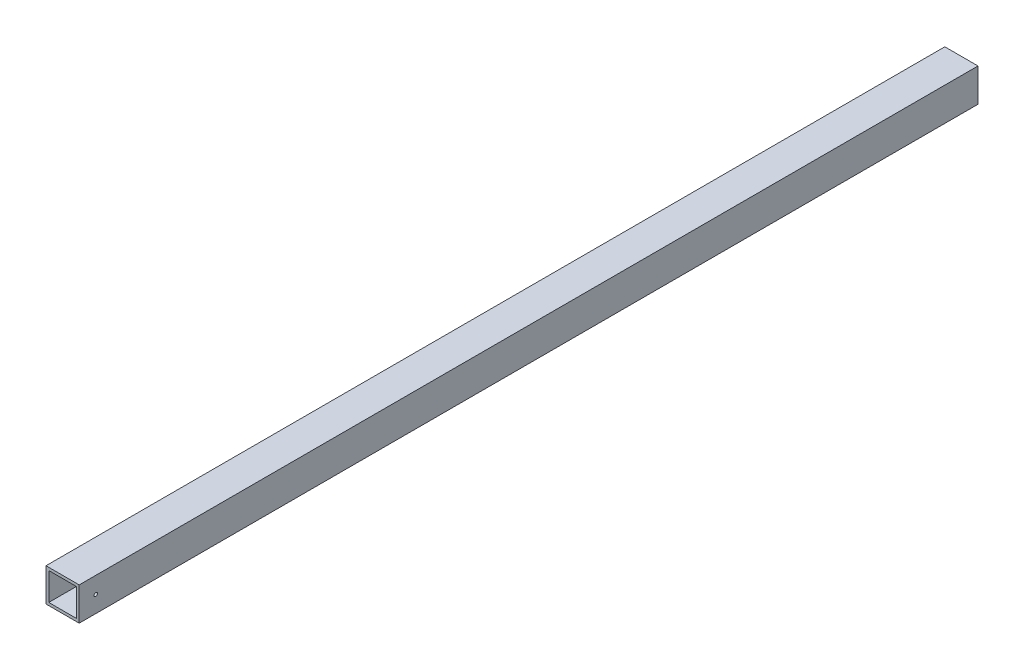
ISO-10303-21;
HEADER;
FILE_DESCRIPTION(('STEP AP214'),'2;1');
FILE_NAME('part.step','',(''),(''),'','','');
FILE_SCHEMA(('AUTOMOTIVE_DESIGN { 1 0 10303 214 1 1 1 1 }'));
ENDSEC;
DATA;
#1=APPLICATION_CONTEXT('core data for automotive mechanical design processes');
#2=APPLICATION_PROTOCOL_DEFINITION('international standard','automotive_design',2000,#1);
#3=PRODUCT_CONTEXT('',#1,'mechanical');
#4=PRODUCT('Part','Part','',(#3));
#5=PRODUCT_RELATED_PRODUCT_CATEGORY('part','',(#4));
#6=PRODUCT_DEFINITION_FORMATION('','',#4);
#7=PRODUCT_DEFINITION_CONTEXT('part definition',#1,'design');
#8=PRODUCT_DEFINITION('design','',#6,#7);
#9=PRODUCT_DEFINITION_SHAPE('','',#8);
#10=(LENGTH_UNIT() NAMED_UNIT(*) SI_UNIT(.MILLI.,.METRE.));
#11=(NAMED_UNIT(*) PLANE_ANGLE_UNIT() SI_UNIT($,.RADIAN.));
#12=(NAMED_UNIT(*) SI_UNIT($,.STERADIAN.) SOLID_ANGLE_UNIT());
#13=UNCERTAINTY_MEASURE_WITH_UNIT(LENGTH_MEASURE(1.E-05),#10,'distance_accuracy_value','');
#14=(GEOMETRIC_REPRESENTATION_CONTEXT(3) GLOBAL_UNCERTAINTY_ASSIGNED_CONTEXT((#13)) GLOBAL_UNIT_ASSIGNED_CONTEXT((#10,
#11,#12)) REPRESENTATION_CONTEXT('',''));
#15=CARTESIAN_POINT('',(0.,0.,0.));
#16=DIRECTION('',(0.,0.,1.));
#17=DIRECTION('',(1.,0.,0.));
#18=AXIS2_PLACEMENT_3D('',#15,#16,#17);
#19=CARTESIAN_POINT('',(0.,0.,650.));
#20=DIRECTION('',(0.,0.,1.));
#21=DIRECTION('',(1.,0.,0.));
#22=AXIS2_PLACEMENT_3D('',#19,#20,#21);
#23=PLANE('',#22);
#24=DIRECTION('',(0.,-1.,0.));
#25=VECTOR('',#24,1.);
#26=CARTESIAN_POINT('',(-12.,12.,650.));
#27=LINE('',#26,#25);
#28=CARTESIAN_POINT('',(-12.,12.,650.));
#29=VERTEX_POINT('',#28);
#30=CARTESIAN_POINT('',(-12.,-12.,650.));
#31=VERTEX_POINT('',#30);
#32=EDGE_CURVE('E138',#29,#31,#27,.T.);
#33=ORIENTED_EDGE('',*,*,#32,.T.);
#34=DIRECTION('',(1.,0.,0.));
#35=VECTOR('',#34,1.);
#36=CARTESIAN_POINT('',(-12.,-12.,650.));
#37=LINE('',#36,#35);
#38=CARTESIAN_POINT('',(12.,-12.,650.));
#39=VERTEX_POINT('',#38);
#40=EDGE_CURVE('E141',#31,#39,#37,.T.);
#41=ORIENTED_EDGE('',*,*,#40,.T.);
#42=DIRECTION('',(0.,1.,0.));
#43=VECTOR('',#42,1.);
#44=CARTESIAN_POINT('',(12.,12.,650.));
#45=LINE('',#44,#43);
#46=CARTESIAN_POINT('',(12.,12.,650.));
#47=VERTEX_POINT('',#46);
#48=EDGE_CURVE('E144',#39,#47,#45,.T.);
#49=ORIENTED_EDGE('',*,*,#48,.T.);
#50=DIRECTION('',(-1.,0.,0.));
#51=VECTOR('',#50,1.);
#52=CARTESIAN_POINT('',(-12.,12.,650.));
#53=LINE('',#52,#51);
#54=EDGE_CURVE('E146',#47,#29,#53,.T.);
#55=ORIENTED_EDGE('',*,*,#54,.T.);
#56=EDGE_LOOP('',(#33,#41,#49,#55));
#57=FACE_BOUND('',#56,.T.);
#58=DIRECTION('',(-1.,0.,0.));
#59=VECTOR('',#58,1.);
#60=CARTESIAN_POINT('',(-10.,10.,650.));
#61=LINE('',#60,#59);
#62=CARTESIAN_POINT('',(10.,10.,650.));
#63=VERTEX_POINT('',#62);
#64=CARTESIAN_POINT('',(-10.,10.,650.));
#65=VERTEX_POINT('',#64);
#66=EDGE_CURVE('E108',#63,#65,#61,.T.);
#67=ORIENTED_EDGE('',*,*,#66,.F.);
#68=DIRECTION('',(0.,1.,0.));
#69=VECTOR('',#68,1.);
#70=CARTESIAN_POINT('',(10.,10.,650.));
#71=LINE('',#70,#69);
#72=CARTESIAN_POINT('',(10.,-10.,650.));
#73=VERTEX_POINT('',#72);
#74=EDGE_CURVE('E100',#73,#63,#71,.T.);
#75=ORIENTED_EDGE('',*,*,#74,.F.);
#76=DIRECTION('',(1.,0.,0.));
#77=VECTOR('',#76,1.);
#78=CARTESIAN_POINT('',(-10.,-10.,650.));
#79=LINE('',#78,#77);
#80=CARTESIAN_POINT('',(-10.,-10.,650.));
#81=VERTEX_POINT('',#80);
#82=EDGE_CURVE('E122',#81,#73,#79,.T.);
#83=ORIENTED_EDGE('',*,*,#82,.F.);
#84=DIRECTION('',(0.,-1.,0.));
#85=VECTOR('',#84,1.);
#86=CARTESIAN_POINT('',(-10.,10.,650.));
#87=LINE('',#86,#85);
#88=EDGE_CURVE('E120',#65,#81,#87,.T.);
#89=ORIENTED_EDGE('',*,*,#88,.F.);
#90=EDGE_LOOP('',(#67,#75,#83,#89));
#91=FACE_BOUND('',#90,.T.);
#92=ADVANCED_FACE('F35',(#57,#91),#23,.T.);
#93=CARTESIAN_POINT('',(0.,0.,0.));
#94=DIRECTION('',(0.,0.,1.));
#95=DIRECTION('',(1.,0.,0.));
#96=AXIS2_PLACEMENT_3D('',#93,#94,#95);
#97=PLANE('',#96);
#98=DIRECTION('',(0.,-1.,0.));
#99=VECTOR('',#98,1.);
#100=CARTESIAN_POINT('',(-12.,12.,0.));
#101=LINE('',#100,#99);
#102=CARTESIAN_POINT('',(-12.,12.,0.));
#103=VERTEX_POINT('',#102);
#104=CARTESIAN_POINT('',(-12.,-12.,0.));
#105=VERTEX_POINT('',#104);
#106=EDGE_CURVE('E116',#103,#105,#101,.T.);
#107=ORIENTED_EDGE('',*,*,#106,.F.);
#108=DIRECTION('',(-1.,0.,0.));
#109=VECTOR('',#108,1.);
#110=CARTESIAN_POINT('',(-12.,12.,0.));
#111=LINE('',#110,#109);
#112=CARTESIAN_POINT('',(12.,12.,0.));
#113=VERTEX_POINT('',#112);
#114=EDGE_CURVE('E142',#113,#103,#111,.T.);
#115=ORIENTED_EDGE('',*,*,#114,.F.);
#116=DIRECTION('',(0.,1.,0.));
#117=VECTOR('',#116,1.);
#118=CARTESIAN_POINT('',(12.,12.,0.));
#119=LINE('',#118,#117);
#120=CARTESIAN_POINT('',(12.,-12.,0.));
#121=VERTEX_POINT('',#120);
#122=EDGE_CURVE('E153',#121,#113,#119,.T.);
#123=ORIENTED_EDGE('',*,*,#122,.F.);
#124=DIRECTION('',(1.,0.,0.));
#125=VECTOR('',#124,1.);
#126=CARTESIAN_POINT('',(-12.,-12.,0.));
#127=LINE('',#126,#125);
#128=EDGE_CURVE('E151',#105,#121,#127,.T.);
#129=ORIENTED_EDGE('',*,*,#128,.F.);
#130=EDGE_LOOP('',(#107,#115,#123,#129));
#131=FACE_BOUND('',#130,.T.);
#132=DIRECTION('',(0.,1.,0.));
#133=VECTOR('',#132,1.);
#134=CARTESIAN_POINT('',(10.,10.,0.));
#135=LINE('',#134,#133);
#136=CARTESIAN_POINT('',(10.,-10.,0.));
#137=VERTEX_POINT('',#136);
#138=CARTESIAN_POINT('',(10.,10.,0.));
#139=VERTEX_POINT('',#138);
#140=EDGE_CURVE('E58',#137,#139,#135,.T.);
#141=ORIENTED_EDGE('',*,*,#140,.T.);
#142=DIRECTION('',(-1.,0.,0.));
#143=VECTOR('',#142,1.);
#144=CARTESIAN_POINT('',(-10.,10.,0.));
#145=LINE('',#144,#143);
#146=CARTESIAN_POINT('',(-10.,10.,0.));
#147=VERTEX_POINT('',#146);
#148=EDGE_CURVE('E115',#139,#147,#145,.T.);
#149=ORIENTED_EDGE('',*,*,#148,.T.);
#150=DIRECTION('',(0.,-1.,0.));
#151=VECTOR('',#150,1.);
#152=CARTESIAN_POINT('',(-10.,10.,0.));
#153=LINE('',#152,#151);
#154=CARTESIAN_POINT('',(-10.,-10.,0.));
#155=VERTEX_POINT('',#154);
#156=EDGE_CURVE('E130',#147,#155,#153,.T.);
#157=ORIENTED_EDGE('',*,*,#156,.T.);
#158=DIRECTION('',(1.,0.,0.));
#159=VECTOR('',#158,1.);
#160=CARTESIAN_POINT('',(-10.,-10.,0.));
#161=LINE('',#160,#159);
#162=EDGE_CURVE('E109',#155,#137,#161,.T.);
#163=ORIENTED_EDGE('',*,*,#162,.T.);
#164=EDGE_LOOP('',(#141,#149,#157,#163));
#165=FACE_BOUND('',#164,.T.);
#166=ADVANCED_FACE('F171',(#131,#165),#97,.F.);
#167=CARTESIAN_POINT('',(-12.,12.,650.));
#168=DIRECTION('',(1.,0.,0.));
#169=DIRECTION('',(0.,1.,0.));
#170=AXIS2_PLACEMENT_3D('',#167,#168,#169);
#171=PLANE('',#170);
#172=CARTESIAN_POINT('',(-12.,0.,638.));
#173=DIRECTION('',(-1.,0.,0.));
#174=DIRECTION('',(0.,0.,1.));
#175=AXIS2_PLACEMENT_3D('',#172,#173,#174);
#176=CIRCLE('',#175,1.24999999999999);
#177=CARTESIAN_POINT('',(-12.,0.,639.25));
#178=VERTEX_POINT('',#177);
#179=EDGE_CURVE('E218',#178,#178,#176,.T.);
#180=ORIENTED_EDGE('',*,*,#179,.F.);
#181=EDGE_LOOP('',(#180));
#182=FACE_BOUND('',#181,.T.);
#183=ORIENTED_EDGE('',*,*,#106,.T.);
#184=DIRECTION('',(0.,0.,-1.));
#185=VECTOR('',#184,1.);
#186=CARTESIAN_POINT('',(-12.,-12.,650.));
#187=LINE('',#186,#185);
#188=EDGE_CURVE('E11',#31,#105,#187,.T.);
#189=ORIENTED_EDGE('',*,*,#188,.F.);
#190=ORIENTED_EDGE('',*,*,#32,.F.);
#191=DIRECTION('',(0.,0.,-1.));
#192=VECTOR('',#191,1.);
#193=CARTESIAN_POINT('',(-12.,12.,650.));
#194=LINE('',#193,#192);
#195=EDGE_CURVE('E148',#29,#103,#194,.T.);
#196=ORIENTED_EDGE('',*,*,#195,.T.);
#197=EDGE_LOOP('',(#183,#189,#190,#196));
#198=FACE_BOUND('',#197,.T.);
#199=ADVANCED_FACE('F37',(#182,#198),#171,.F.);
#200=CARTESIAN_POINT('',(-12.,-12.,650.));
#201=DIRECTION('',(0.,1.,0.));
#202=DIRECTION('',(-1.,0.,0.));
#203=AXIS2_PLACEMENT_3D('',#200,#201,#202);
#204=PLANE('',#203);
#205=ORIENTED_EDGE('',*,*,#128,.T.);
#206=DIRECTION('',(0.,0.,-1.));
#207=VECTOR('',#206,1.);
#208=CARTESIAN_POINT('',(12.,-12.,650.));
#209=LINE('',#208,#207);
#210=EDGE_CURVE('E43',#39,#121,#209,.T.);
#211=ORIENTED_EDGE('',*,*,#210,.F.);
#212=ORIENTED_EDGE('',*,*,#40,.F.);
#213=ORIENTED_EDGE('',*,*,#188,.T.);
#214=EDGE_LOOP('',(#205,#211,#212,#213));
#215=FACE_BOUND('',#214,.T.);
#216=ADVANCED_FACE('F181',(#215),#204,.F.);
#217=CARTESIAN_POINT('',(12.,12.,650.));
#218=DIRECTION('',(-1.,0.,0.));
#219=DIRECTION('',(0.,-1.,0.));
#220=AXIS2_PLACEMENT_3D('',#217,#218,#219);
#221=PLANE('',#220);
#222=CARTESIAN_POINT('',(12.,0.,638.));
#223=DIRECTION('',(-1.,0.,0.));
#224=DIRECTION('',(0.,0.,1.));
#225=AXIS2_PLACEMENT_3D('',#222,#223,#224);
#226=CIRCLE('',#225,1.24999999999998);
#227=CARTESIAN_POINT('',(12.,0.,639.25));
#228=VERTEX_POINT('',#227);
#229=EDGE_CURVE('E213',#228,#228,#226,.T.);
#230=ORIENTED_EDGE('',*,*,#229,.T.);
#231=EDGE_LOOP('',(#230));
#232=FACE_BOUND('',#231,.T.);
#233=ORIENTED_EDGE('',*,*,#122,.T.);
#234=DIRECTION('',(0.,0.,-1.));
#235=VECTOR('',#234,1.);
#236=CARTESIAN_POINT('',(12.,12.,650.));
#237=LINE('',#236,#235);
#238=EDGE_CURVE('E158',#47,#113,#237,.T.);
#239=ORIENTED_EDGE('',*,*,#238,.F.);
#240=ORIENTED_EDGE('',*,*,#48,.F.);
#241=ORIENTED_EDGE('',*,*,#210,.T.);
#242=EDGE_LOOP('',(#233,#239,#240,#241));
#243=FACE_BOUND('',#242,.T.);
#244=ADVANCED_FACE('F165',(#232,#243),#221,.F.);
#245=CARTESIAN_POINT('',(-12.,12.,650.));
#246=DIRECTION('',(0.,-1.,0.));
#247=DIRECTION('',(0.,0.,-1.));
#248=AXIS2_PLACEMENT_3D('',#245,#246,#247);
#249=PLANE('',#248);
#250=ORIENTED_EDGE('',*,*,#114,.T.);
#251=ORIENTED_EDGE('',*,*,#195,.F.);
#252=ORIENTED_EDGE('',*,*,#54,.F.);
#253=ORIENTED_EDGE('',*,*,#238,.T.);
#254=EDGE_LOOP('',(#250,#251,#252,#253));
#255=FACE_BOUND('',#254,.T.);
#256=ADVANCED_FACE('F175',(#255),#249,.F.);
#257=CARTESIAN_POINT('',(10.,10.,650.));
#258=DIRECTION('',(-1.,0.,0.));
#259=DIRECTION('',(0.,0.,1.));
#260=AXIS2_PLACEMENT_3D('',#257,#258,#259);
#261=PLANE('',#260);
#262=CARTESIAN_POINT('',(10.,0.,638.));
#263=DIRECTION('',(-1.,0.,0.));
#264=DIRECTION('',(0.,0.,1.));
#265=AXIS2_PLACEMENT_3D('',#262,#263,#264);
#266=CIRCLE('',#265,1.24999999999999);
#267=CARTESIAN_POINT('',(10.,0.,639.25));
#268=VERTEX_POINT('',#267);
#269=EDGE_CURVE('E128',#268,#268,#266,.T.);
#270=ORIENTED_EDGE('',*,*,#269,.F.);
#271=EDGE_LOOP('',(#270));
#272=FACE_BOUND('',#271,.T.);
#273=ORIENTED_EDGE('',*,*,#140,.F.);
#274=DIRECTION('',(0.,0.,-1.));
#275=VECTOR('',#274,1.);
#276=CARTESIAN_POINT('',(10.,-10.,650.));
#277=LINE('',#276,#275);
#278=EDGE_CURVE('E104',#73,#137,#277,.T.);
#279=ORIENTED_EDGE('',*,*,#278,.F.);
#280=ORIENTED_EDGE('',*,*,#74,.T.);
#281=DIRECTION('',(0.,0.,-1.));
#282=VECTOR('',#281,1.);
#283=CARTESIAN_POINT('',(10.,10.,650.));
#284=LINE('',#283,#282);
#285=EDGE_CURVE('E103',#63,#139,#284,.T.);
#286=ORIENTED_EDGE('',*,*,#285,.T.);
#287=EDGE_LOOP('',(#273,#279,#280,#286));
#288=FACE_BOUND('',#287,.T.);
#289=ADVANCED_FACE('F102',(#272,#288),#261,.T.);
#290=CARTESIAN_POINT('',(-10.,10.,650.));
#291=DIRECTION('',(0.,-1.,0.));
#292=DIRECTION('',(0.,0.,-1.));
#293=AXIS2_PLACEMENT_3D('',#290,#291,#292);
#294=PLANE('',#293);
#295=ORIENTED_EDGE('',*,*,#148,.F.);
#296=ORIENTED_EDGE('',*,*,#285,.F.);
#297=ORIENTED_EDGE('',*,*,#66,.T.);
#298=DIRECTION('',(0.,0.,-1.));
#299=VECTOR('',#298,1.);
#300=CARTESIAN_POINT('',(-10.,10.,650.));
#301=LINE('',#300,#299);
#302=EDGE_CURVE('E117',#65,#147,#301,.T.);
#303=ORIENTED_EDGE('',*,*,#302,.T.);
#304=EDGE_LOOP('',(#295,#296,#297,#303));
#305=FACE_BOUND('',#304,.T.);
#306=ADVANCED_FACE('F112',(#305),#294,.T.);
#307=CARTESIAN_POINT('',(-10.,10.,650.));
#308=DIRECTION('',(1.,0.,0.));
#309=DIRECTION('',(0.,1.,0.));
#310=AXIS2_PLACEMENT_3D('',#307,#308,#309);
#311=PLANE('',#310);
#312=CARTESIAN_POINT('',(-10.,0.,638.));
#313=DIRECTION('',(1.,0.,0.));
#314=DIRECTION('',(0.,1.,0.));
#315=AXIS2_PLACEMENT_3D('',#312,#313,#314);
#316=CIRCLE('',#315,1.24999999999999);
#317=CARTESIAN_POINT('',(-10.,1.24999999999998,638.));
#318=VERTEX_POINT('',#317);
#319=EDGE_CURVE('E211',#318,#318,#316,.T.);
#320=ORIENTED_EDGE('',*,*,#319,.F.);
#321=EDGE_LOOP('',(#320));
#322=FACE_BOUND('',#321,.T.);
#323=ORIENTED_EDGE('',*,*,#156,.F.);
#324=ORIENTED_EDGE('',*,*,#302,.F.);
#325=ORIENTED_EDGE('',*,*,#88,.T.);
#326=DIRECTION('',(0.,0.,-1.));
#327=VECTOR('',#326,1.);
#328=CARTESIAN_POINT('',(-10.,-10.,650.));
#329=LINE('',#328,#327);
#330=EDGE_CURVE('E50',#81,#155,#329,.T.);
#331=ORIENTED_EDGE('',*,*,#330,.T.);
#332=EDGE_LOOP('',(#323,#324,#325,#331));
#333=FACE_BOUND('',#332,.T.);
#334=ADVANCED_FACE('F207',(#322,#333),#311,.T.);
#335=CARTESIAN_POINT('',(-10.,-10.,650.));
#336=DIRECTION('',(0.,1.,0.));
#337=DIRECTION('',(0.,0.,1.));
#338=AXIS2_PLACEMENT_3D('',#335,#336,#337);
#339=PLANE('',#338);
#340=ORIENTED_EDGE('',*,*,#162,.F.);
#341=ORIENTED_EDGE('',*,*,#330,.F.);
#342=ORIENTED_EDGE('',*,*,#82,.T.);
#343=ORIENTED_EDGE('',*,*,#278,.T.);
#344=EDGE_LOOP('',(#340,#341,#342,#343));
#345=FACE_BOUND('',#344,.T.);
#346=ADVANCED_FACE('F225',(#345),#339,.T.);
#347=CARTESIAN_POINT('',(-12.,0.,638.));
#348=DIRECTION('',(-1.,0.,0.));
#349=DIRECTION('',(0.,0.,1.));
#350=AXIS2_PLACEMENT_3D('',#347,#348,#349);
#351=CYLINDRICAL_SURFACE('',#350,1.24999999999999);
#352=ORIENTED_EDGE('',*,*,#319,.T.);
#353=EDGE_LOOP('',(#352));
#354=FACE_BOUND('',#353,.T.);
#355=ORIENTED_EDGE('',*,*,#179,.T.);
#356=EDGE_LOOP('',(#355));
#357=FACE_BOUND('',#356,.T.);
#358=ADVANCED_FACE('F222',(#354,#357),#351,.F.);
#359=ORIENTED_EDGE('',*,*,#269,.T.);
#360=EDGE_LOOP('',(#359));
#361=FACE_BOUND('',#360,.T.);
#362=ORIENTED_EDGE('',*,*,#229,.F.);
#363=EDGE_LOOP('',(#362));
#364=FACE_BOUND('',#363,.T.);
#365=ADVANCED_FACE('F224',(#361,#364),#351,.F.);
#366=CLOSED_SHELL('',(#92,#166,#199,#216,#244,#256,#289,#306,#334,#346,#358,#365));
#367=MANIFOLD_SOLID_BREP('B2',#366);
#368=ADVANCED_BREP_SHAPE_REPRESENTATION('',(#18,#367),#14);
#369=SHAPE_DEFINITION_REPRESENTATION(#9,#368);
ENDSEC;
END-ISO-10303-21;
